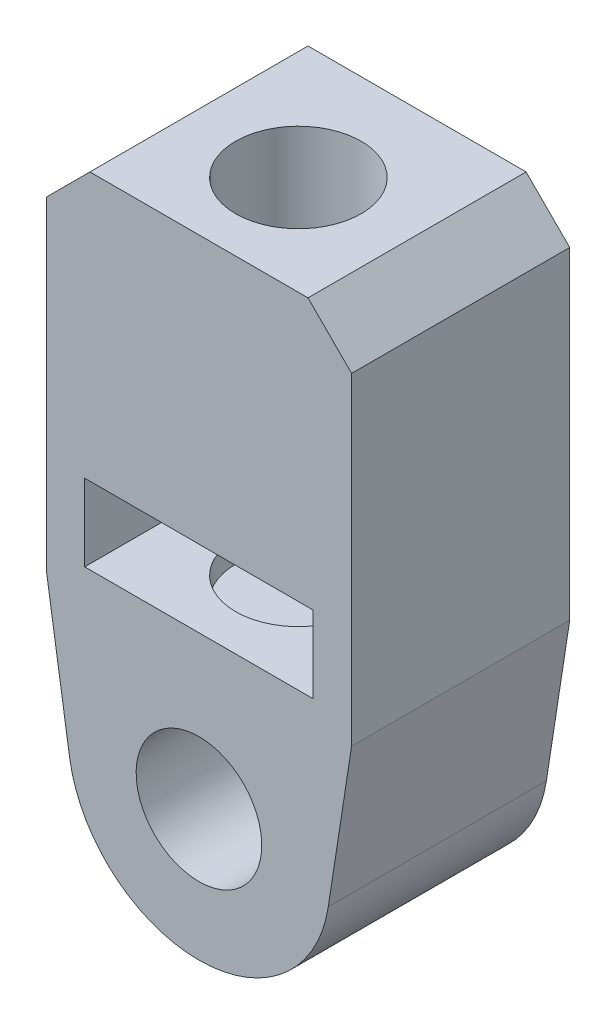
ISO-10303-21;
HEADER;
FILE_DESCRIPTION(('STEP AP214'),'2;1');
FILE_NAME('part.step','',(''),(''),'','','');
FILE_SCHEMA(('AUTOMOTIVE_DESIGN { 1 0 10303 214 1 1 1 1 }'));
ENDSEC;
DATA;
#1=APPLICATION_CONTEXT('core data for automotive mechanical design processes');
#2=APPLICATION_PROTOCOL_DEFINITION('international standard','automotive_design',2000,#1);
#3=PRODUCT_CONTEXT('',#1,'mechanical');
#4=PRODUCT('Part','Part','',(#3));
#5=PRODUCT_RELATED_PRODUCT_CATEGORY('part','',(#4));
#6=PRODUCT_DEFINITION_FORMATION('','',#4);
#7=PRODUCT_DEFINITION_CONTEXT('part definition',#1,'design');
#8=PRODUCT_DEFINITION('design','',#6,#7);
#9=PRODUCT_DEFINITION_SHAPE('','',#8);
#10=(LENGTH_UNIT() NAMED_UNIT(*) SI_UNIT(.MILLI.,.METRE.));
#11=(NAMED_UNIT(*) PLANE_ANGLE_UNIT() SI_UNIT($,.RADIAN.));
#12=(NAMED_UNIT(*) SI_UNIT($,.STERADIAN.) SOLID_ANGLE_UNIT());
#13=UNCERTAINTY_MEASURE_WITH_UNIT(LENGTH_MEASURE(1.E-05),#10,'distance_accuracy_value','');
#14=(GEOMETRIC_REPRESENTATION_CONTEXT(3) GLOBAL_UNCERTAINTY_ASSIGNED_CONTEXT((#13)) GLOBAL_UNIT_ASSIGNED_CONTEXT((#10,
#11,#12)) REPRESENTATION_CONTEXT('',''));
#15=CARTESIAN_POINT('',(0.,0.,0.));
#16=DIRECTION('',(0.,0.,1.));
#17=DIRECTION('',(1.,0.,0.));
#18=AXIS2_PLACEMENT_3D('',#15,#16,#17);
#19=CARTESIAN_POINT('',(0.,0.,33.3553531007244));
#20=DIRECTION('',(0.,0.,-1.));
#21=DIRECTION('',(-1.,0.,0.));
#22=AXIS2_PLACEMENT_3D('',#19,#20,#21);
#23=CYLINDRICAL_SURFACE('',#22,4.7625);
#24=CARTESIAN_POINT('',(0.,0.,7.93750000000003));
#25=DIRECTION('',(0.,0.,1.));
#26=DIRECTION('',(0.,-1.,0.));
#27=AXIS2_PLACEMENT_3D('',#24,#25,#26);
#28=CIRCLE('',#27,4.7625);
#29=CARTESIAN_POINT('',(-4.70647058823529,-0.728382352941177,7.93750000000003));
#30=VERTEX_POINT('',#29);
#31=CARTESIAN_POINT('',(4.70647058823529,-0.72838235294118,7.93750000000003));
#32=VERTEX_POINT('',#31);
#33=EDGE_CURVE('E232',#30,#32,#28,.T.);
#34=ORIENTED_EDGE('',*,*,#33,.F.);
#35=DIRECTION('',(0.,0.,-1.));
#36=VECTOR('',#35,1.);
#37=CARTESIAN_POINT('',(-4.70647058823529,-0.728382352941177,33.3553531007244));
#38=LINE('',#37,#36);
#39=CARTESIAN_POINT('',(-4.70647058823529,-0.728382352941177,0.));
#40=VERTEX_POINT('',#39);
#41=EDGE_CURVE('E281',#30,#40,#38,.T.);
#42=ORIENTED_EDGE('',*,*,#41,.T.);
#43=CARTESIAN_POINT('',(0.,0.,0.));
#44=DIRECTION('',(0.,0.,1.));
#45=DIRECTION('',(1.,0.,0.));
#46=AXIS2_PLACEMENT_3D('',#43,#44,#45);
#47=CIRCLE('',#46,4.7625);
#48=CARTESIAN_POINT('',(4.70647058823529,-0.72838235294118,0.));
#49=VERTEX_POINT('',#48);
#50=EDGE_CURVE('E274',#40,#49,#47,.T.);
#51=ORIENTED_EDGE('',*,*,#50,.T.);
#52=DIRECTION('',(0.,0.,-1.));
#53=VECTOR('',#52,1.);
#54=CARTESIAN_POINT('',(4.70647058823529,-0.72838235294118,33.3553531007244));
#55=LINE('',#54,#53);
#56=EDGE_CURVE('E278',#32,#49,#55,.T.);
#57=ORIENTED_EDGE('',*,*,#56,.F.);
#58=EDGE_LOOP('',(#34,#42,#51,#57));
#59=FACE_BOUND('',#58,.T.);
#60=ADVANCED_FACE('F48',(#59),#23,.T.);
#61=CARTESIAN_POINT('',(-5.55625,4.7625,33.3553531007244));
#62=DIRECTION('',(0.988235294117647,0.152941176470588,0.));
#63=DIRECTION('',(-0.152941176470588,0.988235294117647,0.));
#64=AXIS2_PLACEMENT_3D('',#61,#62,#63);
#65=PLANE('',#64);
#66=DIRECTION('',(0.152941176470588,-0.988235294117647,0.));
#67=VECTOR('',#66,1.);
#68=CARTESIAN_POINT('',(-5.55625000000001,4.76250000000004,7.93750000000005));
#69=LINE('',#68,#67);
#70=CARTESIAN_POINT('',(-5.55625,4.7625,7.93750000000004));
#71=VERTEX_POINT('',#70);
#72=EDGE_CURVE('E236',#71,#30,#69,.T.);
#73=ORIENTED_EDGE('',*,*,#72,.F.);
#74=DIRECTION('',(0.,0.,-1.));
#75=VECTOR('',#74,1.);
#76=CARTESIAN_POINT('',(-5.55625,4.7625,33.3553531007244));
#77=LINE('',#76,#75);
#78=CARTESIAN_POINT('',(-5.55625,4.7625,0.));
#79=VERTEX_POINT('',#78);
#80=EDGE_CURVE('E284',#71,#79,#77,.T.);
#81=ORIENTED_EDGE('',*,*,#80,.T.);
#82=DIRECTION('',(0.152941176470588,-0.988235294117647,0.));
#83=VECTOR('',#82,1.);
#84=CARTESIAN_POINT('',(-5.55625,4.7625,0.));
#85=LINE('',#84,#83);
#86=EDGE_CURVE('E270',#79,#40,#85,.T.);
#87=ORIENTED_EDGE('',*,*,#86,.T.);
#88=ORIENTED_EDGE('',*,*,#41,.F.);
#89=EDGE_LOOP('',(#73,#81,#87,#88));
#90=FACE_BOUND('',#89,.T.);
#91=ADVANCED_FACE('F341',(#90),#65,.F.);
#92=CARTESIAN_POINT('',(-5.55625,4.7625,33.3553531007244));
#93=DIRECTION('',(1.,0.,0.));
#94=DIRECTION('',(0.,0.,-1.));
#95=AXIS2_PLACEMENT_3D('',#92,#93,#94);
#96=PLANE('',#95);
#97=DIRECTION('',(0.,-1.,0.));
#98=VECTOR('',#97,1.);
#99=CARTESIAN_POINT('',(-5.55625,4.76250000000004,7.93750000000005));
#100=LINE('',#99,#98);
#101=CARTESIAN_POINT('',(-5.55625,16.51,7.93750000000006));
#102=VERTEX_POINT('',#101);
#103=EDGE_CURVE('E240',#102,#71,#100,.T.);
#104=ORIENTED_EDGE('',*,*,#103,.F.);
#105=DIRECTION('',(0.,0.,-1.));
#106=VECTOR('',#105,1.);
#107=CARTESIAN_POINT('',(-5.55625,16.51,33.3553531007244));
#108=LINE('',#107,#106);
#109=CARTESIAN_POINT('',(-5.55625,16.51,0.));
#110=VERTEX_POINT('',#109);
#111=EDGE_CURVE('E12',#102,#110,#108,.T.);
#112=ORIENTED_EDGE('',*,*,#111,.T.);
#113=DIRECTION('',(0.,-1.,0.));
#114=VECTOR('',#113,1.);
#115=CARTESIAN_POINT('',(-5.55625,4.7625,0.));
#116=LINE('',#115,#114);
#117=EDGE_CURVE('E267',#110,#79,#116,.T.);
#118=ORIENTED_EDGE('',*,*,#117,.T.);
#119=ORIENTED_EDGE('',*,*,#80,.F.);
#120=EDGE_LOOP('',(#104,#112,#118,#119));
#121=FACE_BOUND('',#120,.T.);
#122=ADVANCED_FACE('F344',(#121),#96,.F.);
#123=CARTESIAN_POINT('',(-5.55625,18.0975,33.3553531007244));
#124=DIRECTION('',(0.,-1.,0.));
#125=DIRECTION('',(0.,0.,-1.));
#126=AXIS2_PLACEMENT_3D('',#123,#124,#125);
#127=PLANE('',#126);
#128=CARTESIAN_POINT('',(2.5449401150063E-07,18.0975,4.31875040854182));
#129=DIRECTION('',(0.,1.,0.));
#130=DIRECTION('',(0.,0.,1.));
#131=AXIS2_PLACEMENT_3D('',#128,#129,#130);
#132=CIRCLE('',#131,2.286);
#133=CARTESIAN_POINT('',(2.5449401150063E-07,18.0975,6.60475040854182));
#134=VERTEX_POINT('',#133);
#135=EDGE_CURVE('E223',#134,#134,#132,.T.);
#136=ORIENTED_EDGE('',*,*,#135,.F.);
#137=EDGE_LOOP('',(#136));
#138=FACE_BOUND('',#137,.T.);
#139=DIRECTION('',(-1.,0.,0.));
#140=VECTOR('',#139,1.);
#141=CARTESIAN_POINT('',(-5.55625,18.0975,7.93750000000007));
#142=LINE('',#141,#140);
#143=CARTESIAN_POINT('',(3.96875,18.0975,7.93750000000007));
#144=VERTEX_POINT('',#143);
#145=CARTESIAN_POINT('',(-3.96874999999999,18.0975,7.93750000000007));
#146=VERTEX_POINT('',#145);
#147=EDGE_CURVE('E243',#144,#146,#142,.T.);
#148=ORIENTED_EDGE('',*,*,#147,.F.);
#149=DIRECTION('',(0.,0.,-1.));
#150=VECTOR('',#149,1.);
#151=CARTESIAN_POINT('',(3.96875,18.0975,33.3553531007244));
#152=LINE('',#151,#150);
#153=CARTESIAN_POINT('',(3.96875,18.0975,0.));
#154=VERTEX_POINT('',#153);
#155=EDGE_CURVE('E300',#144,#154,#152,.T.);
#156=ORIENTED_EDGE('',*,*,#155,.T.);
#157=DIRECTION('',(-1.,0.,0.));
#158=VECTOR('',#157,1.);
#159=CARTESIAN_POINT('',(-5.55625,18.0975,0.));
#160=LINE('',#159,#158);
#161=CARTESIAN_POINT('',(-3.96874999999999,18.0975,0.));
#162=VERTEX_POINT('',#161);
#163=EDGE_CURVE('E263',#154,#162,#160,.T.);
#164=ORIENTED_EDGE('',*,*,#163,.T.);
#165=DIRECTION('',(0.,0.,1.));
#166=VECTOR('',#165,1.);
#167=CARTESIAN_POINT('',(-3.96874999999999,18.0975,33.3553531007244));
#168=LINE('',#167,#166);
#169=EDGE_CURVE('E291',#162,#146,#168,.T.);
#170=ORIENTED_EDGE('',*,*,#169,.T.);
#171=EDGE_LOOP('',(#148,#156,#164,#170));
#172=FACE_BOUND('',#171,.T.);
#173=ADVANCED_FACE('F320',(#138,#172),#127,.F.);
#174=CARTESIAN_POINT('',(5.55625,18.0975,33.3553531007244));
#175=DIRECTION('',(-1.,0.,0.));
#176=DIRECTION('',(0.,0.,1.));
#177=AXIS2_PLACEMENT_3D('',#174,#175,#176);
#178=PLANE('',#177);
#179=DIRECTION('',(0.,1.,0.));
#180=VECTOR('',#179,1.);
#181=CARTESIAN_POINT('',(5.55625,18.0975,0.));
#182=LINE('',#181,#180);
#183=CARTESIAN_POINT('',(5.55625,4.7625,0.));
#184=VERTEX_POINT('',#183);
#185=CARTESIAN_POINT('',(5.55625,16.51,0.));
#186=VERTEX_POINT('',#185);
#187=EDGE_CURVE('E260',#184,#186,#182,.T.);
#188=ORIENTED_EDGE('',*,*,#187,.T.);
#189=DIRECTION('',(0.,0.,1.));
#190=VECTOR('',#189,1.);
#191=CARTESIAN_POINT('',(5.55625,16.51,33.3553531007244));
#192=LINE('',#191,#190);
#193=CARTESIAN_POINT('',(5.55625,16.51,7.93750000000006));
#194=VERTEX_POINT('',#193);
#195=EDGE_CURVE('E78',#186,#194,#192,.T.);
#196=ORIENTED_EDGE('',*,*,#195,.T.);
#197=DIRECTION('',(0.,1.,0.));
#198=VECTOR('',#197,1.);
#199=CARTESIAN_POINT('',(5.55625,18.0975,7.93750000000007));
#200=LINE('',#199,#198);
#201=CARTESIAN_POINT('',(5.55625,4.7625,7.93750000000006));
#202=VERTEX_POINT('',#201);
#203=EDGE_CURVE('E246',#202,#194,#200,.T.);
#204=ORIENTED_EDGE('',*,*,#203,.F.);
#205=DIRECTION('',(0.,0.,-1.));
#206=VECTOR('',#205,1.);
#207=CARTESIAN_POINT('',(5.55625,4.7625,33.3553531007244));
#208=LINE('',#207,#206);
#209=EDGE_CURVE('E288',#202,#184,#208,.T.);
#210=ORIENTED_EDGE('',*,*,#209,.T.);
#211=EDGE_LOOP('',(#188,#196,#204,#210));
#212=FACE_BOUND('',#211,.T.);
#213=ADVANCED_FACE('F329',(#212),#178,.F.);
#214=CARTESIAN_POINT('',(4.70647058823529,-0.728382352941177,33.3553531007244));
#215=DIRECTION('',(-0.988235294117647,0.152941176470588,0.));
#216=DIRECTION('',(-0.152941176470588,-0.988235294117647,0.));
#217=AXIS2_PLACEMENT_3D('',#214,#215,#216);
#218=PLANE('',#217);
#219=DIRECTION('',(0.152941176470588,0.988235294117647,0.));
#220=VECTOR('',#219,1.);
#221=CARTESIAN_POINT('',(4.7064705882353,-0.728382352941136,7.93750000000003));
#222=LINE('',#221,#220);
#223=EDGE_CURVE('E249',#32,#202,#222,.T.);
#224=ORIENTED_EDGE('',*,*,#223,.F.);
#225=ORIENTED_EDGE('',*,*,#56,.T.);
#226=DIRECTION('',(0.152941176470588,0.988235294117647,0.));
#227=VECTOR('',#226,1.);
#228=CARTESIAN_POINT('',(4.70647058823529,-0.728382352941177,0.));
#229=LINE('',#228,#227);
#230=EDGE_CURVE('E256',#49,#184,#229,.T.);
#231=ORIENTED_EDGE('',*,*,#230,.T.);
#232=ORIENTED_EDGE('',*,*,#209,.F.);
#233=EDGE_LOOP('',(#224,#225,#231,#232));
#234=FACE_BOUND('',#233,.T.);
#235=ADVANCED_FACE('F333',(#234),#218,.F.);
#236=CARTESIAN_POINT('',(0.,0.,0.));
#237=DIRECTION('',(0.,0.,1.));
#238=DIRECTION('',(1.,0.,0.));
#239=AXIS2_PLACEMENT_3D('',#236,#237,#238);
#240=PLANE('',#239);
#241=ORIENTED_EDGE('',*,*,#163,.F.);
#242=DIRECTION('',(-0.707106781186547,0.707106781186548,0.));
#243=VECTOR('',#242,1.);
#244=CARTESIAN_POINT('',(3.96875,18.0975,0.));
#245=LINE('',#244,#243);
#246=EDGE_CURVE('E307',#154,#186,#245,.F.);
#247=ORIENTED_EDGE('',*,*,#246,.T.);
#248=ORIENTED_EDGE('',*,*,#187,.F.);
#249=ORIENTED_EDGE('',*,*,#230,.F.);
#250=ORIENTED_EDGE('',*,*,#50,.F.);
#251=ORIENTED_EDGE('',*,*,#86,.F.);
#252=ORIENTED_EDGE('',*,*,#117,.F.);
#253=DIRECTION('',(-0.70710678118655,-0.707106781186545,0.));
#254=VECTOR('',#253,1.);
#255=CARTESIAN_POINT('',(-5.55625,16.51,0.));
#256=LINE('',#255,#254);
#257=EDGE_CURVE('E304',#110,#162,#256,.F.);
#258=ORIENTED_EDGE('',*,*,#257,.T.);
#259=EDGE_LOOP('',(#241,#247,#248,#249,#250,#251,#252,#258));
#260=FACE_BOUND('',#259,.T.);
#261=CARTESIAN_POINT('',(0.,0.,0.));
#262=DIRECTION('',(0.,0.,1.));
#263=DIRECTION('',(1.,0.,0.));
#264=AXIS2_PLACEMENT_3D('',#261,#262,#263);
#265=CIRCLE('',#264,2.286);
#266=CARTESIAN_POINT('',(2.286,0.,0.));
#267=VERTEX_POINT('',#266);
#268=EDGE_CURVE('E253',#267,#267,#265,.T.);
#269=ORIENTED_EDGE('',*,*,#268,.T.);
#270=EDGE_LOOP('',(#269));
#271=FACE_BOUND('',#270,.T.);
#272=ADVANCED_FACE('F326',(#260,#271),#240,.F.);
#273=CARTESIAN_POINT('',(0.,0.,33.3553531007244));
#274=DIRECTION('',(0.,0.,-1.));
#275=DIRECTION('',(-1.,0.,0.));
#276=AXIS2_PLACEMENT_3D('',#273,#274,#275);
#277=CYLINDRICAL_SURFACE('',#276,2.286);
#278=ORIENTED_EDGE('',*,*,#268,.F.);
#279=EDGE_LOOP('',(#278));
#280=FACE_BOUND('',#279,.T.);
#281=CARTESIAN_POINT('',(0.,0.,7.93750000000003));
#282=DIRECTION('',(0.,0.,1.));
#283=DIRECTION('',(0.,-1.,0.));
#284=AXIS2_PLACEMENT_3D('',#281,#282,#283);
#285=CIRCLE('',#284,2.286);
#286=CARTESIAN_POINT('',(0.,-2.286,7.93750000000003));
#287=VERTEX_POINT('',#286);
#288=EDGE_CURVE('E231',#287,#287,#285,.T.);
#289=ORIENTED_EDGE('',*,*,#288,.T.);
#290=EDGE_LOOP('',(#289));
#291=FACE_BOUND('',#290,.T.);
#292=ADVANCED_FACE('F378',(#280,#291),#277,.F.);
#293=CARTESIAN_POINT('',(47.4890302807231,-26.8617976031862,7.93749999999999));
#294=DIRECTION('',(0.,0.,1.));
#295=DIRECTION('',(0.934610112980951,-0.35567391908001,0.));
#296=AXIS2_PLACEMENT_3D('',#293,#294,#295);
#297=PLANE('',#296);
#298=DIRECTION('',(1.,0.,0.));
#299=VECTOR('',#298,1.);
#300=CARTESIAN_POINT('',(-4.15652495524176,8.35025,7.93750000000007));
#301=LINE('',#300,#299);
#302=CARTESIAN_POINT('',(-4.15652495524176,8.35025,7.93750000000007));
#303=VERTEX_POINT('',#302);
#304=CARTESIAN_POINT('',(4.15652178630643,8.35025,7.93750000000006));
#305=VERTEX_POINT('',#304);
#306=EDGE_CURVE('E583',#303,#305,#301,.T.);
#307=ORIENTED_EDGE('',*,*,#306,.T.);
#308=DIRECTION('',(0.,-1.,0.));
#309=VECTOR('',#308,1.);
#310=CARTESIAN_POINT('',(4.15652178630643,8.35025,7.93750000000006));
#311=LINE('',#310,#309);
#312=CARTESIAN_POINT('',(4.15652178630643,5.55625,7.93750000000006));
#313=VERTEX_POINT('',#312);
#314=EDGE_CURVE('E572',#305,#313,#311,.T.);
#315=ORIENTED_EDGE('',*,*,#314,.T.);
#316=DIRECTION('',(1.,0.,0.));
#317=VECTOR('',#316,1.);
#318=CARTESIAN_POINT('',(-4.15652495524176,5.55625,7.93750000000007));
#319=LINE('',#318,#317);
#320=CARTESIAN_POINT('',(-4.15652495524176,5.55625,7.93750000000005));
#321=VERTEX_POINT('',#320);
#322=EDGE_CURVE('E558',#321,#313,#319,.T.);
#323=ORIENTED_EDGE('',*,*,#322,.F.);
#324=DIRECTION('',(0.,-1.,0.));
#325=VECTOR('',#324,1.);
#326=CARTESIAN_POINT('',(-4.15652495524176,8.35025,7.93750000000007));
#327=LINE('',#326,#325);
#328=EDGE_CURVE('E219',#303,#321,#327,.T.);
#329=ORIENTED_EDGE('',*,*,#328,.F.);
#330=EDGE_LOOP('',(#307,#315,#323,#329));
#331=FACE_BOUND('',#330,.T.);
#332=ORIENTED_EDGE('',*,*,#288,.F.);
#333=EDGE_LOOP('',(#332));
#334=FACE_BOUND('',#333,.T.);
#335=ORIENTED_EDGE('',*,*,#203,.T.);
#336=DIRECTION('',(0.707106781186547,-0.707106781186548,0.));
#337=VECTOR('',#336,1.);
#338=CARTESIAN_POINT('',(48.2085389419546,-26.1422889419547,7.93749999999999));
#339=LINE('',#338,#337);
#340=EDGE_CURVE('E58',#194,#144,#339,.F.);
#341=ORIENTED_EDGE('',*,*,#340,.T.);
#342=ORIENTED_EDGE('',*,*,#147,.T.);
#343=DIRECTION('',(0.70710678118655,0.707106781186545,0.));
#344=VECTOR('',#343,1.);
#345=CARTESIAN_POINT('',(-0.719508661231383,21.3467413387686,7.93750000000007));
#346=LINE('',#345,#344);
#347=EDGE_CURVE('E68',#146,#102,#346,.F.);
#348=ORIENTED_EDGE('',*,*,#347,.T.);
#349=ORIENTED_EDGE('',*,*,#103,.T.);
#350=ORIENTED_EDGE('',*,*,#72,.T.);
#351=ORIENTED_EDGE('',*,*,#33,.T.);
#352=ORIENTED_EDGE('',*,*,#223,.T.);
#353=EDGE_LOOP('',(#335,#341,#342,#348,#349,#350,#351,#352));
#354=FACE_BOUND('',#353,.T.);
#355=ADVANCED_FACE('F316',(#331,#334,#354),#297,.T.);
#356=CARTESIAN_POINT('',(2.5449401150063E-07,-6.46578440716979,4.31875040854182));
#357=DIRECTION('',(0.,1.,0.));
#358=DIRECTION('',(0.,0.,1.));
#359=AXIS2_PLACEMENT_3D('',#356,#357,#358);
#360=CYLINDRICAL_SURFACE('',#359,2.286);
#361=CARTESIAN_POINT('',(2.5449401150063E-07,8.35025,4.31875040854182));
#362=DIRECTION('',(0.,1.,0.));
#363=DIRECTION('',(0.,0.,1.));
#364=AXIS2_PLACEMENT_3D('',#361,#362,#363);
#365=CIRCLE('',#364,2.286);
#366=CARTESIAN_POINT('',(2.5449401150063E-07,8.35025,6.60475040854182));
#367=VERTEX_POINT('',#366);
#368=EDGE_CURVE('E216',#367,#367,#365,.F.);
#369=ORIENTED_EDGE('',*,*,#368,.T.);
#370=EDGE_LOOP('',(#369));
#371=FACE_BOUND('',#370,.T.);
#372=ORIENTED_EDGE('',*,*,#135,.T.);
#373=EDGE_LOOP('',(#372));
#374=FACE_BOUND('',#373,.T.);
#375=ADVANCED_FACE('F387',(#371,#374),#360,.F.);
#376=CARTESIAN_POINT('',(0.,8.35025,0.));
#377=DIRECTION('',(0.,1.,0.));
#378=DIRECTION('',(0.,0.,1.));
#379=AXIS2_PLACEMENT_3D('',#376,#377,#378);
#380=PLANE('',#379);
#381=DIRECTION('',(-1.,0.,0.));
#382=VECTOR('',#381,1.);
#383=CARTESIAN_POINT('',(1.90641084335816,8.35025,1.01675040854181));
#384=LINE('',#383,#382);
#385=CARTESIAN_POINT('',(1.90641084335816,8.35025,1.01675040854181));
#386=VERTEX_POINT('',#385);
#387=CARTESIAN_POINT('',(-1.90641033437013,8.35025,1.01675040854181));
#388=VERTEX_POINT('',#387);
#389=EDGE_CURVE('E186',#386,#388,#384,.T.);
#390=ORIENTED_EDGE('',*,*,#389,.F.);
#391=DIRECTION('',(-0.5,0.,-0.866025403784439));
#392=VECTOR('',#391,1.);
#393=CARTESIAN_POINT('',(4.15652178630643,8.35025,4.91405688439494));
#394=LINE('',#393,#392);
#395=CARTESIAN_POINT('',(4.15652178630643,8.35025,4.91405688439494));
#396=VERTEX_POINT('',#395);
#397=EDGE_CURVE('E553',#396,#386,#394,.T.);
#398=ORIENTED_EDGE('',*,*,#397,.F.);
#399=DIRECTION('',(0.,0.,-1.));
#400=VECTOR('',#399,1.);
#401=CARTESIAN_POINT('',(4.15652178630643,8.35025,7.93750000000006));
#402=LINE('',#401,#400);
#403=EDGE_CURVE('E585',#305,#396,#402,.T.);
#404=ORIENTED_EDGE('',*,*,#403,.F.);
#405=ORIENTED_EDGE('',*,*,#306,.F.);
#406=DIRECTION('',(0.,0.,1.));
#407=VECTOR('',#406,1.);
#408=CARTESIAN_POINT('',(-4.15652495524176,8.35025,4.91406325474505));
#409=LINE('',#408,#407);
#410=CARTESIAN_POINT('',(-4.15652495524176,8.35025,4.91406325474505));
#411=VERTEX_POINT('',#410);
#412=EDGE_CURVE('E188',#411,#303,#409,.T.);
#413=ORIENTED_EDGE('',*,*,#412,.F.);
#414=DIRECTION('',(-0.5,0.,0.866025403784439));
#415=VECTOR('',#414,1.);
#416=CARTESIAN_POINT('',(-1.90641033437013,8.35025,1.01675040854181));
#417=LINE('',#416,#415);
#418=EDGE_CURVE('E181',#388,#411,#417,.T.);
#419=ORIENTED_EDGE('',*,*,#418,.F.);
#420=EDGE_LOOP('',(#390,#398,#404,#405,#413,#419));
#421=FACE_BOUND('',#420,.T.);
#422=ORIENTED_EDGE('',*,*,#368,.F.);
#423=EDGE_LOOP('',(#422));
#424=FACE_BOUND('',#423,.T.);
#425=ADVANCED_FACE('F183',(#421,#424),#380,.F.);
#426=CARTESIAN_POINT('',(0.,5.55625,0.));
#427=DIRECTION('',(0.,1.,0.));
#428=DIRECTION('',(0.,0.,1.));
#429=AXIS2_PLACEMENT_3D('',#426,#427,#428);
#430=PLANE('',#429);
#431=DIRECTION('',(-1.,0.,0.));
#432=VECTOR('',#431,1.);
#433=CARTESIAN_POINT('',(1.90641084335816,5.55625,1.01675040854181));
#434=LINE('',#433,#432);
#435=CARTESIAN_POINT('',(1.90641084335816,5.55625,1.01675040854181));
#436=VERTEX_POINT('',#435);
#437=CARTESIAN_POINT('',(-1.90641033437013,5.55625,1.01675040854181));
#438=VERTEX_POINT('',#437);
#439=EDGE_CURVE('E544',#436,#438,#434,.T.);
#440=ORIENTED_EDGE('',*,*,#439,.T.);
#441=DIRECTION('',(-0.5,0.,0.866025403784439));
#442=VECTOR('',#441,1.);
#443=CARTESIAN_POINT('',(-1.90641033437013,5.55625,1.01675040854181));
#444=LINE('',#443,#442);
#445=CARTESIAN_POINT('',(-4.15652495524176,5.55625,4.91406325474505));
#446=VERTEX_POINT('',#445);
#447=EDGE_CURVE('E208',#438,#446,#444,.T.);
#448=ORIENTED_EDGE('',*,*,#447,.T.);
#449=DIRECTION('',(0.,0.,1.));
#450=VECTOR('',#449,1.);
#451=CARTESIAN_POINT('',(-4.15652495524176,5.55625,4.91406325474505));
#452=LINE('',#451,#450);
#453=EDGE_CURVE('E550',#446,#321,#452,.T.);
#454=ORIENTED_EDGE('',*,*,#453,.T.);
#455=ORIENTED_EDGE('',*,*,#322,.T.);
#456=DIRECTION('',(0.,0.,-1.));
#457=VECTOR('',#456,1.);
#458=CARTESIAN_POINT('',(4.15652178630643,5.55625,7.93750000000006));
#459=LINE('',#458,#457);
#460=CARTESIAN_POINT('',(4.15652178630643,5.55625,4.91405688439494));
#461=VERTEX_POINT('',#460);
#462=EDGE_CURVE('E561',#313,#461,#459,.T.);
#463=ORIENTED_EDGE('',*,*,#462,.T.);
#464=DIRECTION('',(-0.5,0.,-0.866025403784439));
#465=VECTOR('',#464,1.);
#466=CARTESIAN_POINT('',(4.15652178630643,5.55625,4.91405688439494));
#467=LINE('',#466,#465);
#468=EDGE_CURVE('E205',#461,#436,#467,.T.);
#469=ORIENTED_EDGE('',*,*,#468,.T.);
#470=EDGE_LOOP('',(#440,#448,#454,#455,#463,#469));
#471=FACE_BOUND('',#470,.T.);
#472=CARTESIAN_POINT('',(2.5449401150063E-07,5.55625,4.31875040854182));
#473=DIRECTION('',(0.,1.,0.));
#474=DIRECTION('',(0.,0.,1.));
#475=AXIS2_PLACEMENT_3D('',#472,#473,#474);
#476=CIRCLE('',#475,2.286);
#477=CARTESIAN_POINT('',(2.5449401150063E-07,5.55625,6.60475040854182));
#478=VERTEX_POINT('',#477);
#479=EDGE_CURVE('E210',#478,#478,#476,.F.);
#480=ORIENTED_EDGE('',*,*,#479,.T.);
#481=EDGE_LOOP('',(#480));
#482=FACE_BOUND('',#481,.T.);
#483=ADVANCED_FACE('F402',(#471,#482),#430,.T.);
#484=CARTESIAN_POINT('',(1.90641084335816,8.35025,1.01675040854181));
#485=DIRECTION('',(0.,0.,1.));
#486=DIRECTION('',(0.,-1.,0.));
#487=AXIS2_PLACEMENT_3D('',#484,#485,#486);
#488=PLANE('',#487);
#489=ORIENTED_EDGE('',*,*,#439,.F.);
#490=DIRECTION('',(0.,-1.,0.));
#491=VECTOR('',#490,1.);
#492=CARTESIAN_POINT('',(1.90641084335816,8.35025,1.01675040854181));
#493=LINE('',#492,#491);
#494=EDGE_CURVE('E203',#386,#436,#493,.T.);
#495=ORIENTED_EDGE('',*,*,#494,.F.);
#496=ORIENTED_EDGE('',*,*,#389,.T.);
#497=DIRECTION('',(0.,-1.,0.));
#498=VECTOR('',#497,1.);
#499=CARTESIAN_POINT('',(-1.90641033437013,8.35025,1.01675040854181));
#500=LINE('',#499,#498);
#501=EDGE_CURVE('E200',#388,#438,#500,.T.);
#502=ORIENTED_EDGE('',*,*,#501,.T.);
#503=EDGE_LOOP('',(#489,#495,#496,#502));
#504=FACE_BOUND('',#503,.T.);
#505=ADVANCED_FACE('F199',(#504),#488,.T.);
#506=CARTESIAN_POINT('',(-1.90641033437013,8.35025,1.01675040854181));
#507=DIRECTION('',(0.866025403784439,0.,0.5));
#508=DIRECTION('',(0.5,0.,-0.866025403784439));
#509=AXIS2_PLACEMENT_3D('',#506,#507,#508);
#510=PLANE('',#509);
#511=ORIENTED_EDGE('',*,*,#447,.F.);
#512=ORIENTED_EDGE('',*,*,#501,.F.);
#513=ORIENTED_EDGE('',*,*,#418,.T.);
#514=DIRECTION('',(0.,-1.,0.));
#515=VECTOR('',#514,1.);
#516=CARTESIAN_POINT('',(-4.15652495524176,8.35025,4.91406325474505));
#517=LINE('',#516,#515);
#518=EDGE_CURVE('E211',#411,#446,#517,.T.);
#519=ORIENTED_EDGE('',*,*,#518,.T.);
#520=EDGE_LOOP('',(#511,#512,#513,#519));
#521=FACE_BOUND('',#520,.T.);
#522=ADVANCED_FACE('F207',(#521),#510,.T.);
#523=CARTESIAN_POINT('',(-4.15652495524176,8.35025,4.91406325474505));
#524=DIRECTION('',(1.,0.,0.));
#525=DIRECTION('',(0.,1.,0.));
#526=AXIS2_PLACEMENT_3D('',#523,#524,#525);
#527=PLANE('',#526);
#528=ORIENTED_EDGE('',*,*,#453,.F.);
#529=ORIENTED_EDGE('',*,*,#518,.F.);
#530=ORIENTED_EDGE('',*,*,#412,.T.);
#531=ORIENTED_EDGE('',*,*,#328,.T.);
#532=EDGE_LOOP('',(#528,#529,#530,#531));
#533=FACE_BOUND('',#532,.T.);
#534=ADVANCED_FACE('F405',(#533),#527,.T.);
#535=CARTESIAN_POINT('',(4.15652178630643,8.35025,7.93750000000006));
#536=DIRECTION('',(-1.,0.,0.));
#537=DIRECTION('',(0.,-1.,0.));
#538=AXIS2_PLACEMENT_3D('',#535,#536,#537);
#539=PLANE('',#538);
#540=ORIENTED_EDGE('',*,*,#462,.F.);
#541=ORIENTED_EDGE('',*,*,#314,.F.);
#542=ORIENTED_EDGE('',*,*,#403,.T.);
#543=DIRECTION('',(0.,-1.,0.));
#544=VECTOR('',#543,1.);
#545=CARTESIAN_POINT('',(4.15652178630643,8.35025,4.91405688439494));
#546=LINE('',#545,#544);
#547=EDGE_CURVE('E568',#396,#461,#546,.T.);
#548=ORIENTED_EDGE('',*,*,#547,.T.);
#549=EDGE_LOOP('',(#540,#541,#542,#548));
#550=FACE_BOUND('',#549,.T.);
#551=ADVANCED_FACE('F408',(#550),#539,.T.);
#552=CARTESIAN_POINT('',(4.15652178630643,8.35025,4.91405688439494));
#553=DIRECTION('',(-0.866025403784439,0.,0.5));
#554=DIRECTION('',(0.5,0.,0.866025403784438));
#555=AXIS2_PLACEMENT_3D('',#552,#553,#554);
#556=PLANE('',#555);
#557=ORIENTED_EDGE('',*,*,#468,.F.);
#558=ORIENTED_EDGE('',*,*,#547,.F.);
#559=ORIENTED_EDGE('',*,*,#397,.T.);
#560=ORIENTED_EDGE('',*,*,#494,.T.);
#561=EDGE_LOOP('',(#557,#558,#559,#560));
#562=FACE_BOUND('',#561,.T.);
#563=ADVANCED_FACE('F398',(#562),#556,.T.);
#564=CARTESIAN_POINT('',(0.,4.7625,0.));
#565=DIRECTION('',(0.,1.,0.));
#566=DIRECTION('',(0.,0.,1.));
#567=AXIS2_PLACEMENT_3D('',#564,#565,#566);
#568=PLANE('',#567);
#569=CARTESIAN_POINT('',(2.5449401150063E-07,4.7625,4.31875040854182));
#570=DIRECTION('',(0.,1.,0.));
#571=DIRECTION('',(0.,0.,1.));
#572=AXIS2_PLACEMENT_3D('',#569,#570,#571);
#573=CIRCLE('',#572,2.286);
#574=CARTESIAN_POINT('',(2.5449401150063E-07,4.7625,6.60475040854182));
#575=VERTEX_POINT('',#574);
#576=EDGE_CURVE('E227',#575,#575,#573,.F.);
#577=ORIENTED_EDGE('',*,*,#576,.F.);
#578=EDGE_LOOP('',(#577));
#579=FACE_BOUND('',#578,.T.);
#580=ADVANCED_FACE('F396',(#579),#568,.T.);
#581=ORIENTED_EDGE('',*,*,#576,.T.);
#582=EDGE_LOOP('',(#581));
#583=FACE_BOUND('',#582,.T.);
#584=ORIENTED_EDGE('',*,*,#479,.F.);
#585=EDGE_LOOP('',(#584));
#586=FACE_BOUND('',#585,.T.);
#587=ADVANCED_FACE('F351',(#583,#586),#360,.F.);
#588=CARTESIAN_POINT('',(3.96875,18.0975,33.3553531007244));
#589=DIRECTION('',(-0.707106781186548,-0.707106781186547,0.));
#590=DIRECTION('',(0.,0.,-1.));
#591=AXIS2_PLACEMENT_3D('',#588,#589,#590);
#592=PLANE('',#591);
#593=ORIENTED_EDGE('',*,*,#340,.F.);
#594=ORIENTED_EDGE('',*,*,#195,.F.);
#595=ORIENTED_EDGE('',*,*,#246,.F.);
#596=ORIENTED_EDGE('',*,*,#155,.F.);
#597=EDGE_LOOP('',(#593,#594,#595,#596));
#598=FACE_BOUND('',#597,.T.);
#599=ADVANCED_FACE('F323',(#598),#592,.F.);
#600=CARTESIAN_POINT('',(-5.55625,16.51,33.3553531007244));
#601=DIRECTION('',(0.707106781186545,-0.70710678118655,0.));
#602=DIRECTION('',(0.,0.,-1.));
#603=AXIS2_PLACEMENT_3D('',#600,#601,#602);
#604=PLANE('',#603);
#605=ORIENTED_EDGE('',*,*,#347,.F.);
#606=ORIENTED_EDGE('',*,*,#169,.F.);
#607=ORIENTED_EDGE('',*,*,#257,.F.);
#608=ORIENTED_EDGE('',*,*,#111,.F.);
#609=EDGE_LOOP('',(#605,#606,#607,#608));
#610=FACE_BOUND('',#609,.T.);
#611=ADVANCED_FACE('F51',(#610),#604,.F.);
#612=CLOSED_SHELL('',(#60,#91,#122,#173,#213,#235,#272,#292,#355,#375,#425,#483,#505,#522,#534,
#551,#563,#580,#587,#599,#611));
#613=MANIFOLD_SOLID_BREP('B2',#612);
#614=ADVANCED_BREP_SHAPE_REPRESENTATION('',(#18,#613),#14);
#615=SHAPE_DEFINITION_REPRESENTATION(#9,#614);
ENDSEC;
END-ISO-10303-21;
